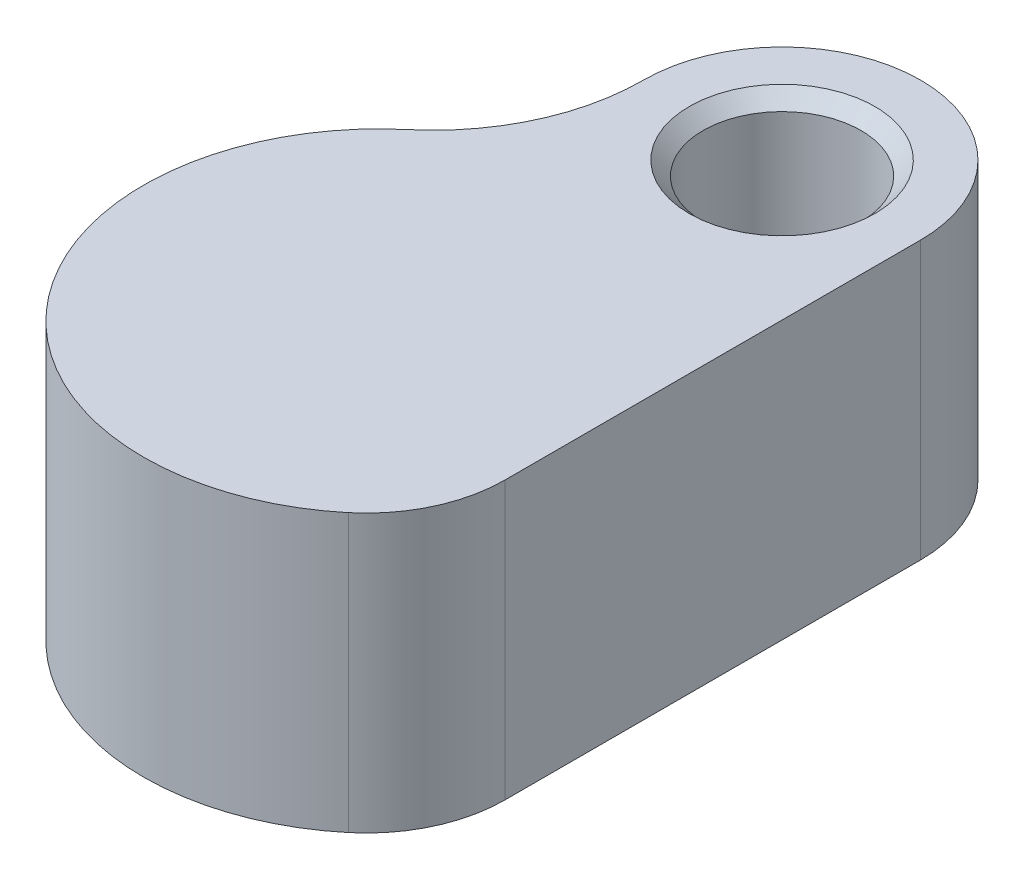
ISO-10303-21;
HEADER;
FILE_DESCRIPTION(('STEP AP214'),'2;1');
FILE_NAME('part.step','',(''),(''),'','','');
FILE_SCHEMA(('AUTOMOTIVE_DESIGN { 1 0 10303 214 1 1 1 1 }'));
ENDSEC;
DATA;
#1=APPLICATION_CONTEXT('core data for automotive mechanical design processes');
#2=APPLICATION_PROTOCOL_DEFINITION('international standard','automotive_design',2000,#1);
#3=PRODUCT_CONTEXT('',#1,'mechanical');
#4=PRODUCT('Part','Part','',(#3));
#5=PRODUCT_RELATED_PRODUCT_CATEGORY('part','',(#4));
#6=PRODUCT_DEFINITION_FORMATION('','',#4);
#7=PRODUCT_DEFINITION_CONTEXT('part definition',#1,'design');
#8=PRODUCT_DEFINITION('design','',#6,#7);
#9=PRODUCT_DEFINITION_SHAPE('','',#8);
#10=(LENGTH_UNIT() NAMED_UNIT(*) SI_UNIT(.MILLI.,.METRE.));
#11=(NAMED_UNIT(*) PLANE_ANGLE_UNIT() SI_UNIT($,.RADIAN.));
#12=(NAMED_UNIT(*) SI_UNIT($,.STERADIAN.) SOLID_ANGLE_UNIT());
#13=UNCERTAINTY_MEASURE_WITH_UNIT(LENGTH_MEASURE(1.E-05),#10,'distance_accuracy_value','');
#14=(GEOMETRIC_REPRESENTATION_CONTEXT(3) GLOBAL_UNCERTAINTY_ASSIGNED_CONTEXT((#13)) GLOBAL_UNIT_ASSIGNED_CONTEXT((#10,
#11,#12)) REPRESENTATION_CONTEXT('',''));
#15=CARTESIAN_POINT('',(0.,0.,0.));
#16=DIRECTION('',(0.,0.,1.));
#17=DIRECTION('',(1.,0.,0.));
#18=AXIS2_PLACEMENT_3D('',#15,#16,#17);
#19=CARTESIAN_POINT('',(-2.23846178480274,8.,12.3094073444726));
#20=DIRECTION('',(0.,-1.,0.));
#21=DIRECTION('',(0.,0.,-1.));
#22=AXIS2_PLACEMENT_3D('',#19,#20,#21);
#23=CYLINDRICAL_SURFACE('',#22,8.50000000000001);
#24=DIRECTION('',(0.,-1.,0.));
#25=VECTOR('',#24,1.);
#26=CARTESIAN_POINT('',(-7.70346784160765,8.,5.79913017686405));
#27=LINE('',#26,#25);
#28=CARTESIAN_POINT('',(-7.70346784160765,8.,5.79913017686405));
#29=VERTEX_POINT('',#28);
#30=CARTESIAN_POINT('',(-7.70346784160765,-2.,5.79913017686405));
#31=VERTEX_POINT('',#30);
#32=EDGE_CURVE('E59',#29,#31,#27,.T.);
#33=ORIENTED_EDGE('',*,*,#32,.T.);
#34=CARTESIAN_POINT('',(-2.23846178480274,-2.,12.3094073444726));
#35=DIRECTION('',(0.,1.,0.));
#36=DIRECTION('',(0.,0.,1.));
#37=AXIS2_PLACEMENT_3D('',#34,#35,#36);
#38=CIRCLE('',#37,8.5);
#39=CARTESIAN_POINT('',(3.19780254971821,-2.,18.8437037936105));
#40=VERTEX_POINT('',#39);
#41=EDGE_CURVE('E134',#31,#40,#38,.T.);
#42=ORIENTED_EDGE('',*,*,#41,.T.);
#43=DIRECTION('',(0.,-1.,0.));
#44=VECTOR('',#43,1.);
#45=CARTESIAN_POINT('',(3.1978025497182,8.,18.8437037936105));
#46=LINE('',#45,#44);
#47=CARTESIAN_POINT('',(3.1978025497182,8.,18.8437037936105));
#48=VERTEX_POINT('',#47);
#49=EDGE_CURVE('E104',#48,#40,#46,.T.);
#50=ORIENTED_EDGE('',*,*,#49,.F.);
#51=CARTESIAN_POINT('',(-2.23846178480274,8.,12.3094073444726));
#52=DIRECTION('',(0.,1.,0.));
#53=DIRECTION('',(0.,0.,1.));
#54=AXIS2_PLACEMENT_3D('',#51,#52,#53);
#55=CIRCLE('',#54,8.50000000000001);
#56=EDGE_CURVE('E138',#48,#29,#55,.F.);
#57=ORIENTED_EDGE('',*,*,#56,.T.);
#58=EDGE_LOOP('',(#33,#42,#50,#57));
#59=FACE_BOUND('',#58,.T.);
#60=ADVANCED_FACE('F42',(#59),#23,.T.);
#61=CARTESIAN_POINT('',(0.,8.,15.));
#62=DIRECTION('',(0.,-1.,0.));
#63=DIRECTION('',(0.,0.,-1.));
#64=AXIS2_PLACEMENT_3D('',#61,#62,#63);
#65=CYLINDRICAL_SURFACE('',#64,5.);
#66=ORIENTED_EDGE('',*,*,#49,.T.);
#67=CARTESIAN_POINT('',(0.,-2.,15.));
#68=DIRECTION('',(0.,1.,0.));
#69=DIRECTION('',(0.,0.,1.));
#70=AXIS2_PLACEMENT_3D('',#67,#68,#69);
#71=CIRCLE('',#70,5.);
#72=CARTESIAN_POINT('',(5.,-2.,15.));
#73=VERTEX_POINT('',#72);
#74=EDGE_CURVE('E112',#40,#73,#71,.T.);
#75=ORIENTED_EDGE('',*,*,#74,.T.);
#76=DIRECTION('',(0.,-1.,0.));
#77=VECTOR('',#76,1.);
#78=CARTESIAN_POINT('',(5.,8.,15.));
#79=LINE('',#78,#77);
#80=CARTESIAN_POINT('',(5.,8.,15.));
#81=VERTEX_POINT('',#80);
#82=EDGE_CURVE('E94',#81,#73,#79,.T.);
#83=ORIENTED_EDGE('',*,*,#82,.F.);
#84=CARTESIAN_POINT('',(0.,8.,15.));
#85=DIRECTION('',(0.,1.,0.));
#86=DIRECTION('',(0.,0.,1.));
#87=AXIS2_PLACEMENT_3D('',#84,#85,#86);
#88=CIRCLE('',#87,5.);
#89=EDGE_CURVE('E141',#48,#81,#88,.T.);
#90=ORIENTED_EDGE('',*,*,#89,.F.);
#91=EDGE_LOOP('',(#66,#75,#83,#90));
#92=FACE_BOUND('',#91,.T.);
#93=ADVANCED_FACE('F119',(#92),#65,.T.);
#94=CARTESIAN_POINT('',(5.,8.,0.));
#95=DIRECTION('',(-1.,0.,0.));
#96=DIRECTION('',(0.,0.,1.));
#97=AXIS2_PLACEMENT_3D('',#94,#95,#96);
#98=PLANE('',#97);
#99=ORIENTED_EDGE('',*,*,#82,.T.);
#100=DIRECTION('',(0.,0.,-1.));
#101=VECTOR('',#100,1.);
#102=CARTESIAN_POINT('',(5.,-2.,15.));
#103=LINE('',#102,#101);
#104=CARTESIAN_POINT('',(5.,-2.,0.));
#105=VERTEX_POINT('',#104);
#106=EDGE_CURVE('E98',#73,#105,#103,.T.);
#107=ORIENTED_EDGE('',*,*,#106,.T.);
#108=DIRECTION('',(0.,-1.,0.));
#109=VECTOR('',#108,1.);
#110=CARTESIAN_POINT('',(5.,8.,0.));
#111=LINE('',#110,#109);
#112=CARTESIAN_POINT('',(5.,8.,0.));
#113=VERTEX_POINT('',#112);
#114=EDGE_CURVE('E105',#113,#105,#111,.T.);
#115=ORIENTED_EDGE('',*,*,#114,.F.);
#116=DIRECTION('',(0.,0.,-1.));
#117=VECTOR('',#116,1.);
#118=CARTESIAN_POINT('',(5.,8.,0.));
#119=LINE('',#118,#117);
#120=EDGE_CURVE('E99',#81,#113,#119,.T.);
#121=ORIENTED_EDGE('',*,*,#120,.F.);
#122=EDGE_LOOP('',(#99,#107,#115,#121));
#123=FACE_BOUND('',#122,.T.);
#124=ADVANCED_FACE('F96',(#123),#98,.F.);
#125=CARTESIAN_POINT('',(0.,8.,0.));
#126=DIRECTION('',(0.,-1.,0.));
#127=DIRECTION('',(0.,0.,-1.));
#128=AXIS2_PLACEMENT_3D('',#125,#126,#127);
#129=CYLINDRICAL_SURFACE('',#128,5.);
#130=ORIENTED_EDGE('',*,*,#114,.T.);
#131=CARTESIAN_POINT('',(0.,-2.,0.));
#132=DIRECTION('',(0.,1.,0.));
#133=DIRECTION('',(0.,0.,1.));
#134=AXIS2_PLACEMENT_3D('',#131,#132,#133);
#135=CIRCLE('',#134,5.);
#136=CARTESIAN_POINT('',(-5.,-2.,0.));
#137=VERTEX_POINT('',#136);
#138=EDGE_CURVE('E116',#105,#137,#135,.T.);
#139=ORIENTED_EDGE('',*,*,#138,.T.);
#140=DIRECTION('',(0.,-1.,0.));
#141=VECTOR('',#140,1.);
#142=CARTESIAN_POINT('',(-5.,8.,0.));
#143=LINE('',#142,#141);
#144=CARTESIAN_POINT('',(-5.,8.,0.));
#145=VERTEX_POINT('',#144);
#146=EDGE_CURVE('E156',#145,#137,#143,.T.);
#147=ORIENTED_EDGE('',*,*,#146,.F.);
#148=CARTESIAN_POINT('',(0.,8.,0.));
#149=DIRECTION('',(0.,1.,0.));
#150=DIRECTION('',(0.,0.,1.));
#151=AXIS2_PLACEMENT_3D('',#148,#149,#150);
#152=CIRCLE('',#151,5.);
#153=EDGE_CURVE('E67',#113,#145,#152,.T.);
#154=ORIENTED_EDGE('',*,*,#153,.F.);
#155=EDGE_LOOP('',(#130,#139,#147,#154));
#156=FACE_BOUND('',#155,.T.);
#157=ADVANCED_FACE('F191',(#156),#129,.T.);
#158=CARTESIAN_POINT('',(-12.5715065940044,8.,0.));
#159=DIRECTION('',(0.,-1.,0.));
#160=DIRECTION('',(0.,0.,-1.));
#161=AXIS2_PLACEMENT_3D('',#158,#159,#160);
#162=CYLINDRICAL_SURFACE('',#161,7.57150659400437);
#163=ORIENTED_EDGE('',*,*,#146,.T.);
#164=CARTESIAN_POINT('',(-12.5715065940044,-2.,0.));
#165=DIRECTION('',(0.,-1.,0.));
#166=DIRECTION('',(0.,0.,1.));
#167=AXIS2_PLACEMENT_3D('',#164,#165,#166);
#168=CIRCLE('',#167,7.57150659400437);
#169=EDGE_CURVE('E131',#137,#31,#168,.T.);
#170=ORIENTED_EDGE('',*,*,#169,.T.);
#171=ORIENTED_EDGE('',*,*,#32,.F.);
#172=CARTESIAN_POINT('',(-12.5715065940044,8.,0.));
#173=DIRECTION('',(0.,1.,0.));
#174=DIRECTION('',(0.,0.,1.));
#175=AXIS2_PLACEMENT_3D('',#172,#173,#174);
#176=CIRCLE('',#175,7.57150659400437);
#177=EDGE_CURVE('E148',#29,#145,#176,.T.);
#178=ORIENTED_EDGE('',*,*,#177,.T.);
#179=EDGE_LOOP('',(#163,#170,#171,#178));
#180=FACE_BOUND('',#179,.T.);
#181=ADVANCED_FACE('F194',(#180),#162,.F.);
#182=CARTESIAN_POINT('',(0.,8.,0.));
#183=DIRECTION('',(0.,-1.,0.));
#184=DIRECTION('',(0.,0.,-1.));
#185=AXIS2_PLACEMENT_3D('',#182,#183,#184);
#186=CYLINDRICAL_SURFACE('',#185,2.85);
#187=CARTESIAN_POINT('',(0.,7.49999999999999,0.));
#188=DIRECTION('',(0.,1.,0.));
#189=DIRECTION('',(0.,0.,1.));
#190=AXIS2_PLACEMENT_3D('',#187,#188,#189);
#191=CIRCLE('',#190,2.85);
#192=CARTESIAN_POINT('',(0.,7.49999999999999,2.85));
#193=VERTEX_POINT('',#192);
#194=EDGE_CURVE('E52',#193,#193,#191,.T.);
#195=ORIENTED_EDGE('',*,*,#194,.T.);
#196=EDGE_LOOP('',(#195));
#197=FACE_BOUND('',#196,.T.);
#198=CARTESIAN_POINT('',(0.,0.,0.));
#199=DIRECTION('',(0.,1.,0.));
#200=DIRECTION('',(0.,0.,1.));
#201=AXIS2_PLACEMENT_3D('',#198,#199,#200);
#202=CIRCLE('',#201,2.85);
#203=CARTESIAN_POINT('',(0.,0.,2.85));
#204=VERTEX_POINT('',#203);
#205=EDGE_CURVE('E137',#204,#204,#202,.T.);
#206=ORIENTED_EDGE('',*,*,#205,.F.);
#207=EDGE_LOOP('',(#206));
#208=FACE_BOUND('',#207,.T.);
#209=ADVANCED_FACE('F166',(#197,#208),#186,.F.);
#210=CARTESIAN_POINT('',(0.,8.,0.));
#211=DIRECTION('',(0.,1.,0.));
#212=DIRECTION('',(0.,0.,1.));
#213=AXIS2_PLACEMENT_3D('',#210,#211,#212);
#214=PLANE('',#213);
#215=CARTESIAN_POINT('',(0.,8.,0.));
#216=DIRECTION('',(0.,1.,0.));
#217=DIRECTION('',(0.,0.,1.));
#218=AXIS2_PLACEMENT_3D('',#215,#216,#217);
#219=CIRCLE('',#218,3.35000000000001);
#220=CARTESIAN_POINT('',(0.,8.,3.35000000000001));
#221=VERTEX_POINT('',#220);
#222=EDGE_CURVE('E11',#221,#221,#219,.F.);
#223=ORIENTED_EDGE('',*,*,#222,.T.);
#224=EDGE_LOOP('',(#223));
#225=FACE_BOUND('',#224,.T.);
#226=ORIENTED_EDGE('',*,*,#56,.F.);
#227=ORIENTED_EDGE('',*,*,#89,.T.);
#228=ORIENTED_EDGE('',*,*,#120,.T.);
#229=ORIENTED_EDGE('',*,*,#153,.T.);
#230=ORIENTED_EDGE('',*,*,#177,.F.);
#231=EDGE_LOOP('',(#226,#227,#228,#229,#230));
#232=FACE_BOUND('',#231,.T.);
#233=ADVANCED_FACE('F171',(#225,#232),#214,.T.);
#234=CARTESIAN_POINT('',(0.,7.49999999999999,0.));
#235=DIRECTION('',(0.,1.,0.));
#236=DIRECTION('',(0.,0.,1.));
#237=AXIS2_PLACEMENT_3D('',#234,#235,#236);
#238=CONICAL_SURFACE('',#237,2.85,0.785398163397449);
#239=ORIENTED_EDGE('',*,*,#222,.F.);
#240=EDGE_LOOP('',(#239));
#241=FACE_BOUND('',#240,.T.);
#242=ORIENTED_EDGE('',*,*,#194,.F.);
#243=EDGE_LOOP('',(#242));
#244=FACE_BOUND('',#243,.T.);
#245=ADVANCED_FACE('F45',(#241,#244),#238,.F.);
#246=CARTESIAN_POINT('',(0.,0.,15.));
#247=DIRECTION('',(0.,1.,0.));
#248=DIRECTION('',(0.,0.,1.));
#249=AXIS2_PLACEMENT_3D('',#246,#247,#248);
#250=PLANE('',#249);
#251=CARTESIAN_POINT('',(0.,0.,0.));
#252=DIRECTION('',(0.,1.,0.));
#253=DIRECTION('',(0.,0.,1.));
#254=AXIS2_PLACEMENT_3D('',#251,#252,#253);
#255=CIRCLE('',#254,1.6);
#256=CARTESIAN_POINT('',(0.,0.,1.6));
#257=VERTEX_POINT('',#256);
#258=EDGE_CURVE('E125',#257,#257,#255,.T.);
#259=ORIENTED_EDGE('',*,*,#258,.F.);
#260=EDGE_LOOP('',(#259));
#261=FACE_BOUND('',#260,.T.);
#262=ORIENTED_EDGE('',*,*,#205,.T.);
#263=EDGE_LOOP('',(#262));
#264=FACE_BOUND('',#263,.T.);
#265=ADVANCED_FACE('F170',(#261,#264),#250,.T.);
#266=CARTESIAN_POINT('',(0.,-2.,15.));
#267=DIRECTION('',(0.,1.,0.));
#268=DIRECTION('',(0.,0.,1.));
#269=AXIS2_PLACEMENT_3D('',#266,#267,#268);
#270=PLANE('',#269);
#271=CARTESIAN_POINT('',(0.,-2.,0.));
#272=DIRECTION('',(0.,1.,0.));
#273=DIRECTION('',(0.,0.,1.));
#274=AXIS2_PLACEMENT_3D('',#271,#272,#273);
#275=CIRCLE('',#274,1.6);
#276=CARTESIAN_POINT('',(0.,-2.,1.6));
#277=VERTEX_POINT('',#276);
#278=EDGE_CURVE('E121',#277,#277,#275,.T.);
#279=ORIENTED_EDGE('',*,*,#278,.T.);
#280=EDGE_LOOP('',(#279));
#281=FACE_BOUND('',#280,.T.);
#282=ORIENTED_EDGE('',*,*,#74,.F.);
#283=ORIENTED_EDGE('',*,*,#41,.F.);
#284=ORIENTED_EDGE('',*,*,#169,.F.);
#285=ORIENTED_EDGE('',*,*,#138,.F.);
#286=ORIENTED_EDGE('',*,*,#106,.F.);
#287=EDGE_LOOP('',(#282,#283,#284,#285,#286));
#288=FACE_BOUND('',#287,.T.);
#289=ADVANCED_FACE('F110',(#281,#288),#270,.F.);
#290=CARTESIAN_POINT('',(0.,-2.,0.));
#291=DIRECTION('',(0.,1.,0.));
#292=DIRECTION('',(0.,0.,1.));
#293=AXIS2_PLACEMENT_3D('',#290,#291,#292);
#294=CYLINDRICAL_SURFACE('',#293,1.6);
#295=ORIENTED_EDGE('',*,*,#278,.F.);
#296=EDGE_LOOP('',(#295));
#297=FACE_BOUND('',#296,.T.);
#298=ORIENTED_EDGE('',*,*,#258,.T.);
#299=EDGE_LOOP('',(#298));
#300=FACE_BOUND('',#299,.T.);
#301=ADVANCED_FACE('F202',(#297,#300),#294,.F.);
#302=CLOSED_SHELL('',(#60,#93,#124,#157,#181,#209,#233,#245,#265,#289,#301));
#303=MANIFOLD_SOLID_BREP('B2',#302);
#304=ADVANCED_BREP_SHAPE_REPRESENTATION('',(#18,#303),#14);
#305=SHAPE_DEFINITION_REPRESENTATION(#9,#304);
ENDSEC;
END-ISO-10303-21;
